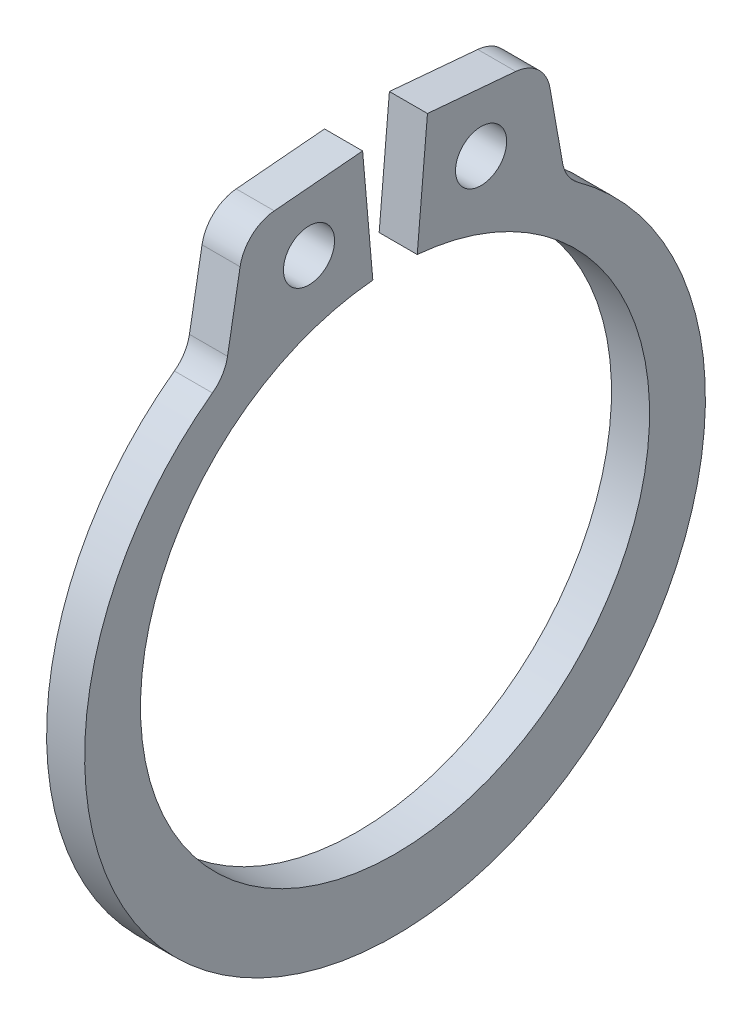
ISO-10303-21;
HEADER;
FILE_DESCRIPTION(('STEP AP214'),'2;1');
FILE_NAME('part.step','',(''),(''),'','','');
FILE_SCHEMA(('AUTOMOTIVE_DESIGN { 1 0 10303 214 1 1 1 1 }'));
ENDSEC;
DATA;
#1=APPLICATION_CONTEXT('core data for automotive mechanical design processes');
#2=APPLICATION_PROTOCOL_DEFINITION('international standard','automotive_design',2000,#1);
#3=PRODUCT_CONTEXT('',#1,'mechanical');
#4=PRODUCT('Part','Part','',(#3));
#5=PRODUCT_RELATED_PRODUCT_CATEGORY('part','',(#4));
#6=PRODUCT_DEFINITION_FORMATION('','',#4);
#7=PRODUCT_DEFINITION_CONTEXT('part definition',#1,'design');
#8=PRODUCT_DEFINITION('design','',#6,#7);
#9=PRODUCT_DEFINITION_SHAPE('','',#8);
#10=(LENGTH_UNIT() NAMED_UNIT(*) SI_UNIT(.MILLI.,.METRE.));
#11=(NAMED_UNIT(*) PLANE_ANGLE_UNIT() SI_UNIT($,.RADIAN.));
#12=(NAMED_UNIT(*) SI_UNIT($,.STERADIAN.) SOLID_ANGLE_UNIT());
#13=UNCERTAINTY_MEASURE_WITH_UNIT(LENGTH_MEASURE(1.E-05),#10,'distance_accuracy_value','');
#14=(GEOMETRIC_REPRESENTATION_CONTEXT(3) GLOBAL_UNCERTAINTY_ASSIGNED_CONTEXT((#13)) GLOBAL_UNIT_ASSIGNED_CONTEXT((#10,
#11,#12)) REPRESENTATION_CONTEXT('',''));
#15=CARTESIAN_POINT('',(0.,0.,0.));
#16=DIRECTION('',(0.,0.,1.));
#17=DIRECTION('',(1.,0.,0.));
#18=AXIS2_PLACEMENT_3D('',#15,#16,#17);
#19=CARTESIAN_POINT('',(0.4445,0.,0.));
#20=DIRECTION('',(1.,0.,0.));
#21=DIRECTION('',(0.,0.,-1.));
#22=AXIS2_PLACEMENT_3D('',#19,#20,#21);
#23=PLANE('',#22);
#24=CARTESIAN_POINT('',(0.4445,7.16740946902652,2.00864202844417));
#25=DIRECTION('',(1.,0.,0.));
#26=DIRECTION('',(0.,0.,-1.));
#27=AXIS2_PLACEMENT_3D('',#24,#25,#26);
#28=CIRCLE('',#27,0.596899999999996);
#29=CARTESIAN_POINT('',(0.4445,7.16740946902652,1.41174202844417));
#30=VERTEX_POINT('',#29);
#31=EDGE_CURVE('E219',#30,#30,#28,.T.);
#32=ORIENTED_EDGE('',*,*,#31,.F.);
#33=EDGE_LOOP('',(#32));
#34=FACE_BOUND('',#33,.T.);
#35=DIRECTION('',(0.,0.984807753012208,0.173648177666931));
#36=VECTOR('',#35,1.);
#37=CARTESIAN_POINT('',(0.4445,8.41383613047492,-3.49926518429335));
#38=LINE('',#37,#36);
#39=CARTESIAN_POINT('',(0.4445,6.07770582063236,-3.91118798836942));
#40=VERTEX_POINT('',#39);
#41=CARTESIAN_POINT('',(0.4445,7.74204588553889,-3.61771992985232));
#42=VERTEX_POINT('',#41);
#43=EDGE_CURVE('E202',#40,#42,#38,.T.);
#44=ORIENTED_EDGE('',*,*,#43,.T.);
#45=CARTESIAN_POINT('',(0.4445,7.58767265559298,-2.74222583742447));
#46=DIRECTION('',(1.,0.,0.));
#47=DIRECTION('',(0.,0.,-1.));
#48=AXIS2_PLACEMENT_3D('',#45,#46,#47);
#49=CIRCLE('',#48,0.889);
#50=CARTESIAN_POINT('',(0.4445,8.47328974219655,-2.81970729272714));
#51=VERTEX_POINT('',#50);
#52=EDGE_CURVE('E170',#42,#51,#49,.T.);
#53=ORIENTED_EDGE('',*,*,#52,.T.);
#54=DIRECTION('',(0.,0.0871557427476612,0.996194698091745));
#55=VECTOR('',#54,1.);
#56=CARTESIAN_POINT('',(0.4445,8.65374410338338,-0.757104506100358));
#57=LINE('',#56,#55);
#58=CARTESIAN_POINT('',(0.4445,8.65374410338338,-0.757104506100358));
#59=VERTEX_POINT('',#58);
#60=EDGE_CURVE('E208',#51,#59,#57,.T.);
#61=ORIENTED_EDGE('',*,*,#60,.T.);
#62=DIRECTION('',(0.,-0.996194698091746,0.0871557427476583));
#63=VECTOR('',#62,1.);
#64=CARTESIAN_POINT('',(0.4445,8.65374410338338,-0.757104506100358));
#65=LINE('',#64,#63);
#66=CARTESIAN_POINT('',(0.4445,5.9209828075781,-0.518018872594982));
#67=VERTEX_POINT('',#66);
#68=EDGE_CURVE('E142',#59,#67,#65,.T.);
#69=ORIENTED_EDGE('',*,*,#68,.T.);
#70=CARTESIAN_POINT('',(0.4445,0.,0.));
#71=DIRECTION('',(-1.,0.,0.));
#72=DIRECTION('',(0.,0.,-1.));
#73=AXIS2_PLACEMENT_3D('',#70,#71,#72);
#74=CIRCLE('',#73,5.9436);
#75=CARTESIAN_POINT('',(0.4445,5.9209828075781,0.518018872594982));
#76=VERTEX_POINT('',#75);
#77=EDGE_CURVE('E136',#67,#76,#74,.T.);
#78=ORIENTED_EDGE('',*,*,#77,.T.);
#79=DIRECTION('',(0.,0.996194698091746,0.0871557427476583));
#80=VECTOR('',#79,1.);
#81=CARTESIAN_POINT('',(0.4445,5.9209828075781,0.518018872594982));
#82=LINE('',#81,#80);
#83=CARTESIAN_POINT('',(0.4445,8.65374410338338,0.757104506100358));
#84=VERTEX_POINT('',#83);
#85=EDGE_CURVE('E125',#76,#84,#82,.T.);
#86=ORIENTED_EDGE('',*,*,#85,.T.);
#87=DIRECTION('',(0.,-0.0871557427476596,0.996194698091745));
#88=VECTOR('',#87,1.);
#89=CARTESIAN_POINT('',(0.4445,8.65374410338338,0.757104506100358));
#90=LINE('',#89,#88);
#91=CARTESIAN_POINT('',(0.4445,8.47328974219655,2.81970729272714));
#92=VERTEX_POINT('',#91);
#93=EDGE_CURVE('E135',#84,#92,#90,.T.);
#94=ORIENTED_EDGE('',*,*,#93,.T.);
#95=CARTESIAN_POINT('',(0.4445,7.58767265559299,2.74222583742448));
#96=DIRECTION('',(1.,0.,0.));
#97=DIRECTION('',(0.,0.,-1.));
#98=AXIS2_PLACEMENT_3D('',#95,#96,#97);
#99=CIRCLE('',#98,0.889);
#100=CARTESIAN_POINT('',(0.4445,7.74204588553889,3.61771992985233));
#101=VERTEX_POINT('',#100);
#102=EDGE_CURVE('E168',#92,#101,#99,.T.);
#103=ORIENTED_EDGE('',*,*,#102,.T.);
#104=DIRECTION('',(0.,-0.984807753012209,0.173648177666927));
#105=VECTOR('',#104,1.);
#106=CARTESIAN_POINT('',(0.4445,8.41383613047492,3.49926518429336));
#107=LINE('',#106,#105);
#108=CARTESIAN_POINT('',(0.4445,6.07770582063236,3.91118798836942));
#109=VERTEX_POINT('',#108);
#110=EDGE_CURVE('E211',#101,#109,#107,.T.);
#111=ORIENTED_EDGE('',*,*,#110,.T.);
#112=CARTESIAN_POINT('',(0.4445,6.23207905057826,4.78668208079727));
#113=DIRECTION('',(1.,0.,0.));
#114=DIRECTION('',(0.,0.,-1.));
#115=AXIS2_PLACEMENT_3D('',#112,#113,#114);
#116=CIRCLE('',#115,0.889);
#117=CARTESIAN_POINT('',(0.4445,5.51320146364033,4.26367537434094));
#118=VERTEX_POINT('',#117);
#119=EDGE_CURVE('E57',#109,#118,#116,.F.);
#120=ORIENTED_EDGE('',*,*,#119,.T.);
#121=CARTESIAN_POINT('',(0.4445,-0.347260030936739,0.));
#122=DIRECTION('',(1.,0.,0.));
#123=DIRECTION('',(0.,0.,-1.));
#124=AXIS2_PLACEMENT_3D('',#121,#122,#123);
#125=CIRCLE('',#124,7.24733996906326);
#126=CARTESIAN_POINT('',(0.4445,5.51320146364033,-4.26367537434094));
#127=VERTEX_POINT('',#126);
#128=EDGE_CURVE('E204',#118,#127,#125,.T.);
#129=ORIENTED_EDGE('',*,*,#128,.T.);
#130=CARTESIAN_POINT('',(0.4445,6.23207905057826,-4.78668208079727));
#131=DIRECTION('',(1.,0.,0.));
#132=DIRECTION('',(0.,0.,-1.));
#133=AXIS2_PLACEMENT_3D('',#130,#131,#132);
#134=CIRCLE('',#133,0.889);
#135=EDGE_CURVE('E11',#127,#40,#134,.F.);
#136=ORIENTED_EDGE('',*,*,#135,.T.);
#137=EDGE_LOOP('',(#44,#53,#61,#69,#78,#86,#94,#103,#111,#120,#129,#136));
#138=FACE_BOUND('',#137,.T.);
#139=CARTESIAN_POINT('',(0.4445,7.16740946902651,-2.00864202844417));
#140=DIRECTION('',(1.,0.,0.));
#141=DIRECTION('',(0.,0.,-1.));
#142=AXIS2_PLACEMENT_3D('',#139,#140,#141);
#143=CIRCLE('',#142,0.5969);
#144=CARTESIAN_POINT('',(0.4445,7.16740946902651,-2.60554202844417));
#145=VERTEX_POINT('',#144);
#146=EDGE_CURVE('E247',#145,#145,#143,.T.);
#147=ORIENTED_EDGE('',*,*,#146,.F.);
#148=EDGE_LOOP('',(#147));
#149=FACE_BOUND('',#148,.T.);
#150=ADVANCED_FACE('F35',(#34,#138,#149),#23,.T.);
#151=CARTESIAN_POINT('',(-0.4445,0.,0.));
#152=DIRECTION('',(1.,0.,0.));
#153=DIRECTION('',(0.,0.,-1.));
#154=AXIS2_PLACEMENT_3D('',#151,#152,#153);
#155=PLANE('',#154);
#156=CARTESIAN_POINT('',(-0.4445,7.16740946902652,2.00864202844417));
#157=DIRECTION('',(1.,0.,0.));
#158=DIRECTION('',(0.,0.,-1.));
#159=AXIS2_PLACEMENT_3D('',#156,#157,#158);
#160=CIRCLE('',#159,0.596899999999996);
#161=CARTESIAN_POINT('',(-0.4445,7.16740946902652,1.41174202844417));
#162=VERTEX_POINT('',#161);
#163=EDGE_CURVE('E244',#162,#162,#160,.T.);
#164=ORIENTED_EDGE('',*,*,#163,.T.);
#165=EDGE_LOOP('',(#164));
#166=FACE_BOUND('',#165,.T.);
#167=DIRECTION('',(0.,0.0871557427476612,0.996194698091745));
#168=VECTOR('',#167,1.);
#169=CARTESIAN_POINT('',(-0.4445,8.65374410338338,-0.757104506100358));
#170=LINE('',#169,#168);
#171=CARTESIAN_POINT('',(-0.4445,8.47328974219655,-2.81970729272714));
#172=VERTEX_POINT('',#171);
#173=CARTESIAN_POINT('',(-0.4445,8.65374410338338,-0.757104506100358));
#174=VERTEX_POINT('',#173);
#175=EDGE_CURVE('E227',#172,#174,#170,.T.);
#176=ORIENTED_EDGE('',*,*,#175,.F.);
#177=CARTESIAN_POINT('',(-0.4445,7.58767265559298,-2.74222583742447));
#178=DIRECTION('',(1.,0.,0.));
#179=DIRECTION('',(0.,0.,-1.));
#180=AXIS2_PLACEMENT_3D('',#177,#178,#179);
#181=CIRCLE('',#180,0.889);
#182=CARTESIAN_POINT('',(-0.4445,7.74204588553889,-3.61771992985232));
#183=VERTEX_POINT('',#182);
#184=EDGE_CURVE('E161',#172,#183,#181,.F.);
#185=ORIENTED_EDGE('',*,*,#184,.T.);
#186=DIRECTION('',(0.,0.984807753012208,0.173648177666931));
#187=VECTOR('',#186,1.);
#188=CARTESIAN_POINT('',(-0.4445,8.41383613047492,-3.49926518429335));
#189=LINE('',#188,#187);
#190=CARTESIAN_POINT('',(-0.4445,6.07770582063236,-3.91118798836942));
#191=VERTEX_POINT('',#190);
#192=EDGE_CURVE('E193',#191,#183,#189,.T.);
#193=ORIENTED_EDGE('',*,*,#192,.F.);
#194=CARTESIAN_POINT('',(-0.4445,6.23207905057826,-4.78668208079727));
#195=DIRECTION('',(1.,0.,0.));
#196=DIRECTION('',(0.,0.,-1.));
#197=AXIS2_PLACEMENT_3D('',#194,#195,#196);
#198=CIRCLE('',#197,0.889);
#199=CARTESIAN_POINT('',(-0.4445,5.51320146364033,-4.26367537434094));
#200=VERTEX_POINT('',#199);
#201=EDGE_CURVE('E43',#191,#200,#198,.T.);
#202=ORIENTED_EDGE('',*,*,#201,.T.);
#203=CARTESIAN_POINT('',(-0.4445,-0.347260030936739,0.));
#204=DIRECTION('',(1.,0.,0.));
#205=DIRECTION('',(0.,0.,-1.));
#206=AXIS2_PLACEMENT_3D('',#203,#204,#205);
#207=CIRCLE('',#206,7.24733996906326);
#208=CARTESIAN_POINT('',(-0.4445,5.51320146364033,4.26367537434094));
#209=VERTEX_POINT('',#208);
#210=EDGE_CURVE('E191',#209,#200,#207,.T.);
#211=ORIENTED_EDGE('',*,*,#210,.F.);
#212=CARTESIAN_POINT('',(-0.4445,6.23207905057826,4.78668208079727));
#213=DIRECTION('',(1.,0.,0.));
#214=DIRECTION('',(0.,0.,-1.));
#215=AXIS2_PLACEMENT_3D('',#212,#213,#214);
#216=CIRCLE('',#215,0.889);
#217=CARTESIAN_POINT('',(-0.4445,6.07770582063236,3.91118798836942));
#218=VERTEX_POINT('',#217);
#219=EDGE_CURVE('E183',#209,#218,#216,.T.);
#220=ORIENTED_EDGE('',*,*,#219,.T.);
#221=DIRECTION('',(0.,-0.984807753012209,0.173648177666927));
#222=VECTOR('',#221,1.);
#223=CARTESIAN_POINT('',(-0.4445,8.41383613047492,3.49926518429336));
#224=LINE('',#223,#222);
#225=CARTESIAN_POINT('',(-0.4445,7.74204588553889,3.61771992985233));
#226=VERTEX_POINT('',#225);
#227=EDGE_CURVE('E198',#226,#218,#224,.T.);
#228=ORIENTED_EDGE('',*,*,#227,.F.);
#229=CARTESIAN_POINT('',(-0.4445,7.58767265559299,2.74222583742448));
#230=DIRECTION('',(1.,0.,0.));
#231=DIRECTION('',(0.,0.,-1.));
#232=AXIS2_PLACEMENT_3D('',#229,#230,#231);
#233=CIRCLE('',#232,0.889);
#234=CARTESIAN_POINT('',(-0.4445,8.47328974219655,2.81970729272714));
#235=VERTEX_POINT('',#234);
#236=EDGE_CURVE('E154',#226,#235,#233,.F.);
#237=ORIENTED_EDGE('',*,*,#236,.T.);
#238=DIRECTION('',(0.,-0.0871557427476596,0.996194698091745));
#239=VECTOR('',#238,1.);
#240=CARTESIAN_POINT('',(-0.4445,8.65374410338338,0.757104506100358));
#241=LINE('',#240,#239);
#242=CARTESIAN_POINT('',(-0.4445,8.65374410338338,0.757104506100358));
#243=VERTEX_POINT('',#242);
#244=EDGE_CURVE('E221',#243,#235,#241,.T.);
#245=ORIENTED_EDGE('',*,*,#244,.F.);
#246=DIRECTION('',(0.,0.996194698091746,0.0871557427476583));
#247=VECTOR('',#246,1.);
#248=CARTESIAN_POINT('',(-0.4445,5.9209828075781,0.518018872594982));
#249=LINE('',#248,#247);
#250=CARTESIAN_POINT('',(-0.4445,5.9209828075781,0.518018872594982));
#251=VERTEX_POINT('',#250);
#252=EDGE_CURVE('E218',#251,#243,#249,.T.);
#253=ORIENTED_EDGE('',*,*,#252,.F.);
#254=CARTESIAN_POINT('',(-0.4445,0.,0.));
#255=DIRECTION('',(-1.,0.,0.));
#256=DIRECTION('',(0.,0.,-1.));
#257=AXIS2_PLACEMENT_3D('',#254,#255,#256);
#258=CIRCLE('',#257,5.9436);
#259=CARTESIAN_POINT('',(-0.4445,5.9209828075781,-0.518018872594982));
#260=VERTEX_POINT('',#259);
#261=EDGE_CURVE('E150',#260,#251,#258,.T.);
#262=ORIENTED_EDGE('',*,*,#261,.F.);
#263=DIRECTION('',(0.,-0.996194698091746,0.0871557427476583));
#264=VECTOR('',#263,1.);
#265=CARTESIAN_POINT('',(-0.4445,8.65374410338338,-0.757104506100358));
#266=LINE('',#265,#264);
#267=EDGE_CURVE('E146',#174,#260,#266,.T.);
#268=ORIENTED_EDGE('',*,*,#267,.F.);
#269=EDGE_LOOP('',(#176,#185,#193,#202,#211,#220,#228,#237,#245,#253,#262,#268));
#270=FACE_BOUND('',#269,.T.);
#271=CARTESIAN_POINT('',(-0.4445,7.16740946902651,-2.00864202844417));
#272=DIRECTION('',(1.,0.,0.));
#273=DIRECTION('',(0.,0.,-1.));
#274=AXIS2_PLACEMENT_3D('',#271,#272,#273);
#275=CIRCLE('',#274,0.5969);
#276=CARTESIAN_POINT('',(-0.4445,7.16740946902651,-2.60554202844417));
#277=VERTEX_POINT('',#276);
#278=EDGE_CURVE('E250',#277,#277,#275,.T.);
#279=ORIENTED_EDGE('',*,*,#278,.T.);
#280=EDGE_LOOP('',(#279));
#281=FACE_BOUND('',#280,.T.);
#282=ADVANCED_FACE('F189',(#166,#270,#281),#155,.F.);
#283=CARTESIAN_POINT('',(0.4445,0.,0.));
#284=DIRECTION('',(-1.,0.,0.));
#285=DIRECTION('',(0.,0.,1.));
#286=AXIS2_PLACEMENT_3D('',#283,#284,#285);
#287=CYLINDRICAL_SURFACE('',#286,5.9436);
#288=ORIENTED_EDGE('',*,*,#261,.T.);
#289=DIRECTION('',(-1.,0.,0.));
#290=VECTOR('',#289,1.);
#291=CARTESIAN_POINT('',(0.4445,5.9209828075781,0.518018872594982));
#292=LINE('',#291,#290);
#293=EDGE_CURVE('E129',#76,#251,#292,.T.);
#294=ORIENTED_EDGE('',*,*,#293,.F.);
#295=ORIENTED_EDGE('',*,*,#77,.F.);
#296=DIRECTION('',(-1.,0.,0.));
#297=VECTOR('',#296,1.);
#298=CARTESIAN_POINT('',(0.4445,5.9209828075781,-0.518018872594982));
#299=LINE('',#298,#297);
#300=EDGE_CURVE('E216',#67,#260,#299,.T.);
#301=ORIENTED_EDGE('',*,*,#300,.T.);
#302=EDGE_LOOP('',(#288,#294,#295,#301));
#303=FACE_BOUND('',#302,.T.);
#304=ADVANCED_FACE('F148',(#303),#287,.F.);
#305=CARTESIAN_POINT('',(0.4445,5.9209828075781,0.518018872594982));
#306=DIRECTION('',(0.,-0.0871557427476583,0.996194698091746));
#307=DIRECTION('',(0.,-0.996194698091746,-0.0871557427476583));
#308=AXIS2_PLACEMENT_3D('',#305,#306,#307);
#309=PLANE('',#308);
#310=ORIENTED_EDGE('',*,*,#252,.T.);
#311=DIRECTION('',(-1.,0.,0.));
#312=VECTOR('',#311,1.);
#313=CARTESIAN_POINT('',(0.4445,8.65374410338338,0.757104506100358));
#314=LINE('',#313,#312);
#315=EDGE_CURVE('E132',#84,#243,#314,.T.);
#316=ORIENTED_EDGE('',*,*,#315,.F.);
#317=ORIENTED_EDGE('',*,*,#85,.F.);
#318=ORIENTED_EDGE('',*,*,#293,.T.);
#319=EDGE_LOOP('',(#310,#316,#317,#318));
#320=FACE_BOUND('',#319,.T.);
#321=ADVANCED_FACE('F127',(#320),#309,.F.);
#322=CARTESIAN_POINT('',(0.4445,8.65374410338338,0.757104506100358));
#323=DIRECTION('',(0.,-0.996194698091745,-0.0871557427476597));
#324=DIRECTION('',(0.,0.0871557427476597,-0.996194698091745));
#325=AXIS2_PLACEMENT_3D('',#322,#323,#324);
#326=PLANE('',#325);
#327=ORIENTED_EDGE('',*,*,#244,.T.);
#328=DIRECTION('',(-1.,0.,0.));
#329=VECTOR('',#328,1.);
#330=CARTESIAN_POINT('',(0.4445,8.47328974219655,2.81970729272714));
#331=LINE('',#330,#329);
#332=EDGE_CURVE('E177',#235,#92,#331,.F.);
#333=ORIENTED_EDGE('',*,*,#332,.T.);
#334=ORIENTED_EDGE('',*,*,#93,.F.);
#335=ORIENTED_EDGE('',*,*,#315,.T.);
#336=EDGE_LOOP('',(#327,#333,#334,#335));
#337=FACE_BOUND('',#336,.T.);
#338=ADVANCED_FACE('F239',(#337),#326,.F.);
#339=CARTESIAN_POINT('',(0.4445,8.41383613047492,3.49926518429336));
#340=DIRECTION('',(0.,-0.173648177666927,-0.984807753012209));
#341=DIRECTION('',(0.,0.984807753012209,-0.173648177666927));
#342=AXIS2_PLACEMENT_3D('',#339,#340,#341);
#343=PLANE('',#342);
#344=ORIENTED_EDGE('',*,*,#110,.F.);
#345=DIRECTION('',(-1.,0.,0.));
#346=VECTOR('',#345,1.);
#347=CARTESIAN_POINT('',(0.4445,7.74204588553889,3.61771992985233));
#348=LINE('',#347,#346);
#349=EDGE_CURVE('E174',#101,#226,#348,.T.);
#350=ORIENTED_EDGE('',*,*,#349,.T.);
#351=ORIENTED_EDGE('',*,*,#227,.T.);
#352=DIRECTION('',(1.,0.,0.));
#353=VECTOR('',#352,1.);
#354=CARTESIAN_POINT('',(0.4445,6.07770582063236,3.91118798836942));
#355=LINE('',#354,#353);
#356=EDGE_CURVE('E172',#218,#109,#355,.T.);
#357=ORIENTED_EDGE('',*,*,#356,.T.);
#358=EDGE_LOOP('',(#344,#350,#351,#357));
#359=FACE_BOUND('',#358,.T.);
#360=ADVANCED_FACE('F280',(#359),#343,.F.);
#361=CARTESIAN_POINT('',(0.4445,-0.347260030936739,0.));
#362=DIRECTION('',(-1.,0.,0.));
#363=DIRECTION('',(0.,0.,1.));
#364=AXIS2_PLACEMENT_3D('',#361,#362,#363);
#365=CYLINDRICAL_SURFACE('',#364,7.24733996906326);
#366=ORIENTED_EDGE('',*,*,#128,.F.);
#367=DIRECTION('',(-1.,0.,0.));
#368=VECTOR('',#367,1.);
#369=CARTESIAN_POINT('',(0.4445,5.51320146364033,4.26367537434094));
#370=LINE('',#369,#368);
#371=EDGE_CURVE('E180',#118,#209,#370,.T.);
#372=ORIENTED_EDGE('',*,*,#371,.T.);
#373=ORIENTED_EDGE('',*,*,#210,.T.);
#374=DIRECTION('',(-1.,0.,0.));
#375=VECTOR('',#374,1.);
#376=CARTESIAN_POINT('',(0.4445,5.51320146364033,-4.26367537434094));
#377=LINE('',#376,#375);
#378=EDGE_CURVE('E50',#200,#127,#377,.F.);
#379=ORIENTED_EDGE('',*,*,#378,.T.);
#380=EDGE_LOOP('',(#366,#372,#373,#379));
#381=FACE_BOUND('',#380,.T.);
#382=ADVANCED_FACE('F196',(#381),#365,.T.);
#383=CARTESIAN_POINT('',(0.4445,8.41383613047492,-3.49926518429335));
#384=DIRECTION('',(0.,-0.173648177666931,0.984807753012208));
#385=DIRECTION('',(0.,-0.984807753012208,-0.173648177666931));
#386=AXIS2_PLACEMENT_3D('',#383,#384,#385);
#387=PLANE('',#386);
#388=ORIENTED_EDGE('',*,*,#192,.T.);
#389=DIRECTION('',(-1.,0.,0.));
#390=VECTOR('',#389,1.);
#391=CARTESIAN_POINT('',(0.4445,7.74204588553889,-3.61771992985232));
#392=LINE('',#391,#390);
#393=EDGE_CURVE('E166',#183,#42,#392,.F.);
#394=ORIENTED_EDGE('',*,*,#393,.T.);
#395=ORIENTED_EDGE('',*,*,#43,.F.);
#396=DIRECTION('',(1.,0.,0.));
#397=VECTOR('',#396,1.);
#398=CARTESIAN_POINT('',(-0.4445,6.07770582063236,-3.91118798836942));
#399=LINE('',#398,#397);
#400=EDGE_CURVE('E163',#40,#191,#399,.F.);
#401=ORIENTED_EDGE('',*,*,#400,.T.);
#402=EDGE_LOOP('',(#388,#394,#395,#401));
#403=FACE_BOUND('',#402,.T.);
#404=ADVANCED_FACE('F206',(#403),#387,.F.);
#405=CARTESIAN_POINT('',(0.4445,8.65374410338338,-0.757104506100358));
#406=DIRECTION('',(0.,-0.996194698091745,0.0871557427476612));
#407=DIRECTION('',(0.,-0.0871557427476612,-0.996194698091745));
#408=AXIS2_PLACEMENT_3D('',#405,#406,#407);
#409=PLANE('',#408);
#410=ORIENTED_EDGE('',*,*,#60,.F.);
#411=DIRECTION('',(-1.,0.,0.));
#412=VECTOR('',#411,1.);
#413=CARTESIAN_POINT('',(0.4445,8.47328974219655,-2.81970729272714));
#414=LINE('',#413,#412);
#415=EDGE_CURVE('E151',#51,#172,#414,.T.);
#416=ORIENTED_EDGE('',*,*,#415,.T.);
#417=ORIENTED_EDGE('',*,*,#175,.T.);
#418=DIRECTION('',(-1.,0.,0.));
#419=VECTOR('',#418,1.);
#420=CARTESIAN_POINT('',(0.4445,8.65374410338338,-0.757104506100358));
#421=LINE('',#420,#419);
#422=EDGE_CURVE('E156',#59,#174,#421,.T.);
#423=ORIENTED_EDGE('',*,*,#422,.F.);
#424=EDGE_LOOP('',(#410,#416,#417,#423));
#425=FACE_BOUND('',#424,.T.);
#426=ADVANCED_FACE('F273',(#425),#409,.F.);
#427=CARTESIAN_POINT('',(0.4445,8.65374410338338,-0.757104506100358));
#428=DIRECTION('',(0.,-0.0871557427476583,-0.996194698091746));
#429=DIRECTION('',(0.,0.996194698091746,-0.0871557427476583));
#430=AXIS2_PLACEMENT_3D('',#427,#428,#429);
#431=PLANE('',#430);
#432=ORIENTED_EDGE('',*,*,#267,.T.);
#433=ORIENTED_EDGE('',*,*,#300,.F.);
#434=ORIENTED_EDGE('',*,*,#68,.F.);
#435=ORIENTED_EDGE('',*,*,#422,.T.);
#436=EDGE_LOOP('',(#432,#433,#434,#435));
#437=FACE_BOUND('',#436,.T.);
#438=ADVANCED_FACE('F234',(#437),#431,.F.);
#439=CARTESIAN_POINT('',(0.4445,7.16740946902652,2.00864202844417));
#440=DIRECTION('',(-1.,0.,0.));
#441=DIRECTION('',(0.,0.,1.));
#442=AXIS2_PLACEMENT_3D('',#439,#440,#441);
#443=CYLINDRICAL_SURFACE('',#442,0.596899999999996);
#444=ORIENTED_EDGE('',*,*,#31,.T.);
#445=EDGE_LOOP('',(#444));
#446=FACE_BOUND('',#445,.T.);
#447=ORIENTED_EDGE('',*,*,#163,.F.);
#448=EDGE_LOOP('',(#447));
#449=FACE_BOUND('',#448,.T.);
#450=ADVANCED_FACE('F268',(#446,#449),#443,.F.);
#451=CARTESIAN_POINT('',(0.4445,7.16740946902651,-2.00864202844417));
#452=DIRECTION('',(-1.,0.,0.));
#453=DIRECTION('',(0.,0.,1.));
#454=AXIS2_PLACEMENT_3D('',#451,#452,#453);
#455=CYLINDRICAL_SURFACE('',#454,0.5969);
#456=ORIENTED_EDGE('',*,*,#146,.T.);
#457=EDGE_LOOP('',(#456));
#458=FACE_BOUND('',#457,.T.);
#459=ORIENTED_EDGE('',*,*,#278,.F.);
#460=EDGE_LOOP('',(#459));
#461=FACE_BOUND('',#460,.T.);
#462=ADVANCED_FACE('F256',(#458,#461),#455,.F.);
#463=CARTESIAN_POINT('',(0.4445,7.58767265559298,-2.74222583742447));
#464=DIRECTION('',(-1.,0.,0.));
#465=DIRECTION('',(0.,0.,1.));
#466=AXIS2_PLACEMENT_3D('',#463,#464,#465);
#467=CYLINDRICAL_SURFACE('',#466,0.889);
#468=ORIENTED_EDGE('',*,*,#52,.F.);
#469=ORIENTED_EDGE('',*,*,#393,.F.);
#470=ORIENTED_EDGE('',*,*,#184,.F.);
#471=ORIENTED_EDGE('',*,*,#415,.F.);
#472=EDGE_LOOP('',(#468,#469,#470,#471));
#473=FACE_BOUND('',#472,.T.);
#474=ADVANCED_FACE('F290',(#473),#467,.T.);
#475=CARTESIAN_POINT('',(0.4445,7.58767265559299,2.74222583742448));
#476=DIRECTION('',(-1.,0.,0.));
#477=DIRECTION('',(0.,0.,1.));
#478=AXIS2_PLACEMENT_3D('',#475,#476,#477);
#479=CYLINDRICAL_SURFACE('',#478,0.889);
#480=ORIENTED_EDGE('',*,*,#102,.F.);
#481=ORIENTED_EDGE('',*,*,#332,.F.);
#482=ORIENTED_EDGE('',*,*,#236,.F.);
#483=ORIENTED_EDGE('',*,*,#349,.F.);
#484=EDGE_LOOP('',(#480,#481,#482,#483));
#485=FACE_BOUND('',#484,.T.);
#486=ADVANCED_FACE('F293',(#485),#479,.T.);
#487=CARTESIAN_POINT('',(0.4445,6.23207905057826,4.78668208079727));
#488=DIRECTION('',(-1.,0.,0.));
#489=DIRECTION('',(0.,0.,1.));
#490=AXIS2_PLACEMENT_3D('',#487,#488,#489);
#491=CYLINDRICAL_SURFACE('',#490,0.889);
#492=ORIENTED_EDGE('',*,*,#119,.F.);
#493=ORIENTED_EDGE('',*,*,#356,.F.);
#494=ORIENTED_EDGE('',*,*,#219,.F.);
#495=ORIENTED_EDGE('',*,*,#371,.F.);
#496=EDGE_LOOP('',(#492,#493,#494,#495));
#497=FACE_BOUND('',#496,.T.);
#498=ADVANCED_FACE('F296',(#497),#491,.F.);
#499=CARTESIAN_POINT('',(0.4445,6.23207905057826,-4.78668208079727));
#500=DIRECTION('',(-1.,0.,0.));
#501=DIRECTION('',(0.,0.,1.));
#502=AXIS2_PLACEMENT_3D('',#499,#500,#501);
#503=CYLINDRICAL_SURFACE('',#502,0.889);
#504=ORIENTED_EDGE('',*,*,#135,.F.);
#505=ORIENTED_EDGE('',*,*,#378,.F.);
#506=ORIENTED_EDGE('',*,*,#201,.F.);
#507=ORIENTED_EDGE('',*,*,#400,.F.);
#508=EDGE_LOOP('',(#504,#505,#506,#507));
#509=FACE_BOUND('',#508,.T.);
#510=ADVANCED_FACE('F37',(#509),#503,.F.);
#511=CLOSED_SHELL('',(#150,#282,#304,#321,#338,#360,#382,#404,#426,#438,#450,#462,#474,#486,
#498,#510));
#512=MANIFOLD_SOLID_BREP('B2',#511);
#513=ADVANCED_BREP_SHAPE_REPRESENTATION('',(#18,#512),#14);
#514=SHAPE_DEFINITION_REPRESENTATION(#9,#513);
ENDSEC;
END-ISO-10303-21;
